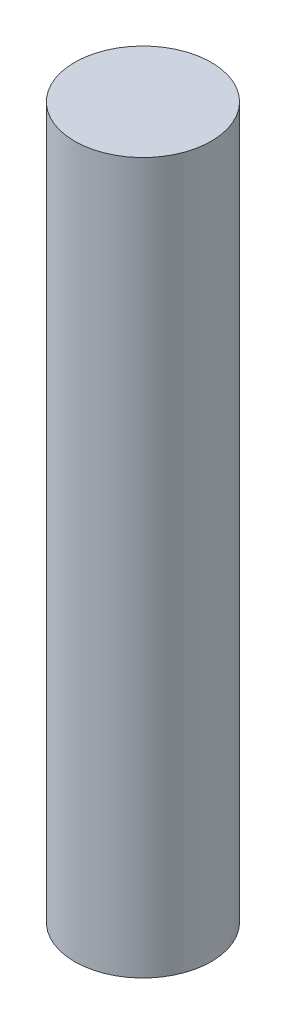
ISO-10303-21;
HEADER;
FILE_DESCRIPTION(('STEP AP214'),'2;1');
FILE_NAME('part.step','',(''),(''),'','','');
FILE_SCHEMA(('AUTOMOTIVE_DESIGN { 1 0 10303 214 1 1 1 1 }'));
ENDSEC;
DATA;
#1=APPLICATION_CONTEXT('core data for automotive mechanical design processes');
#2=APPLICATION_PROTOCOL_DEFINITION('international standard','automotive_design',2000,#1);
#3=PRODUCT_CONTEXT('',#1,'mechanical');
#4=PRODUCT('Part','Part','',(#3));
#5=PRODUCT_RELATED_PRODUCT_CATEGORY('part','',(#4));
#6=PRODUCT_DEFINITION_FORMATION('','',#4);
#7=PRODUCT_DEFINITION_CONTEXT('part definition',#1,'design');
#8=PRODUCT_DEFINITION('design','',#6,#7);
#9=PRODUCT_DEFINITION_SHAPE('','',#8);
#10=(LENGTH_UNIT() NAMED_UNIT(*) SI_UNIT(.MILLI.,.METRE.));
#11=(NAMED_UNIT(*) PLANE_ANGLE_UNIT() SI_UNIT($,.RADIAN.));
#12=(NAMED_UNIT(*) SI_UNIT($,.STERADIAN.) SOLID_ANGLE_UNIT());
#13=UNCERTAINTY_MEASURE_WITH_UNIT(LENGTH_MEASURE(1.E-05),#10,'distance_accuracy_value','');
#14=(GEOMETRIC_REPRESENTATION_CONTEXT(3) GLOBAL_UNCERTAINTY_ASSIGNED_CONTEXT((#13)) GLOBAL_UNIT_ASSIGNED_CONTEXT((#10,
#11,#12)) REPRESENTATION_CONTEXT('',''));
#15=CARTESIAN_POINT('',(0.,0.,0.));
#16=DIRECTION('',(0.,0.,1.));
#17=DIRECTION('',(1.,0.,0.));
#18=AXIS2_PLACEMENT_3D('',#15,#16,#17);
#19=CARTESIAN_POINT('',(0.,78.,0.));
#20=DIRECTION('',(0.,-1.,0.));
#21=DIRECTION('',(0.,0.,-1.));
#22=AXIS2_PLACEMENT_3D('',#19,#20,#21);
#23=CYLINDRICAL_SURFACE('',#22,7.5);
#24=CARTESIAN_POINT('',(0.,78.,0.));
#25=DIRECTION('',(0.,1.,0.));
#26=DIRECTION('',(0.,0.,1.));
#27=AXIS2_PLACEMENT_3D('',#24,#25,#26);
#28=CIRCLE('',#27,7.5);
#29=CARTESIAN_POINT('',(0.,78.,7.5));
#30=VERTEX_POINT('',#29);
#31=EDGE_CURVE('E10',#30,#30,#28,.T.);
#32=ORIENTED_EDGE('',*,*,#31,.F.);
#33=EDGE_LOOP('',(#32));
#34=FACE_BOUND('',#33,.T.);
#35=CARTESIAN_POINT('',(0.,0.,0.));
#36=DIRECTION('',(0.,1.,0.));
#37=DIRECTION('',(0.,0.,1.));
#38=AXIS2_PLACEMENT_3D('',#35,#36,#37);
#39=CIRCLE('',#38,7.5);
#40=CARTESIAN_POINT('',(0.,0.,7.5));
#41=VERTEX_POINT('',#40);
#42=EDGE_CURVE('E40',#41,#41,#39,.T.);
#43=ORIENTED_EDGE('',*,*,#42,.T.);
#44=EDGE_LOOP('',(#43));
#45=FACE_BOUND('',#44,.T.);
#46=ADVANCED_FACE('F37',(#34,#45),#23,.T.);
#47=CARTESIAN_POINT('',(0.,78.,0.));
#48=DIRECTION('',(0.,1.,0.));
#49=DIRECTION('',(0.,0.,1.));
#50=AXIS2_PLACEMENT_3D('',#47,#48,#49);
#51=PLANE('',#50);
#52=ORIENTED_EDGE('',*,*,#31,.T.);
#53=EDGE_LOOP('',(#52));
#54=FACE_BOUND('',#53,.T.);
#55=ADVANCED_FACE('F54',(#54),#51,.T.);
#56=CARTESIAN_POINT('',(0.,0.,0.));
#57=DIRECTION('',(0.,1.,0.));
#58=DIRECTION('',(0.,0.,1.));
#59=AXIS2_PLACEMENT_3D('',#56,#57,#58);
#60=PLANE('',#59);
#61=ORIENTED_EDGE('',*,*,#42,.F.);
#62=EDGE_LOOP('',(#61));
#63=FACE_BOUND('',#62,.T.);
#64=ADVANCED_FACE('F52',(#63),#60,.F.);
#65=CLOSED_SHELL('',(#46,#55,#64));
#66=MANIFOLD_SOLID_BREP('B2',#65);
#67=ADVANCED_BREP_SHAPE_REPRESENTATION('',(#18,#66),#14);
#68=SHAPE_DEFINITION_REPRESENTATION(#9,#67);
ENDSEC;
END-ISO-10303-21;
